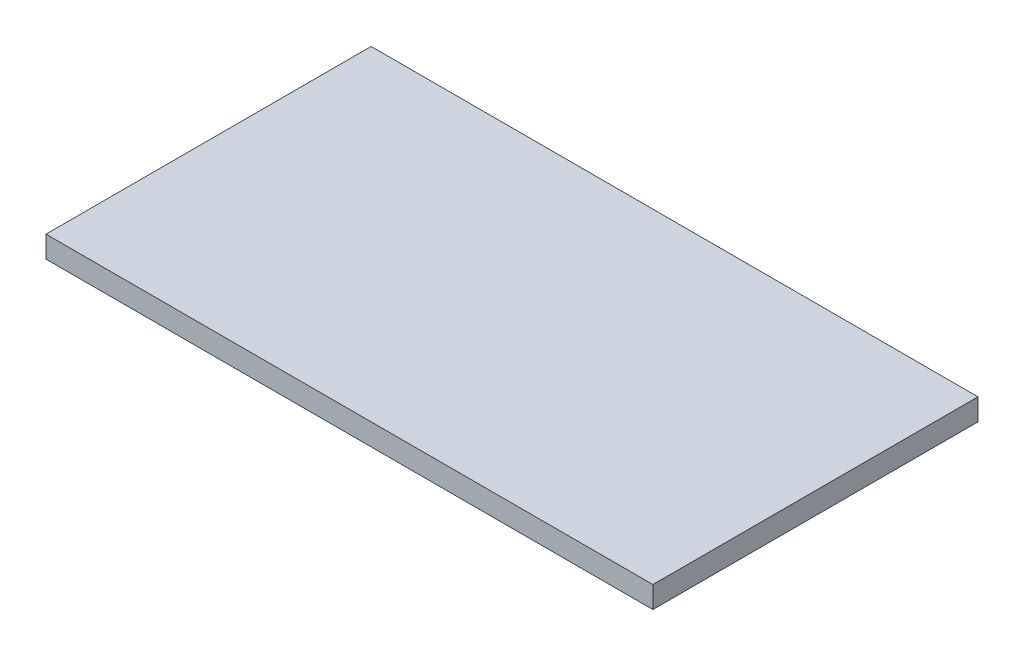
ISO-10303-21;
HEADER;
FILE_DESCRIPTION(('STEP AP214'),'2;1');
FILE_NAME('part.step','',(''),(''),'','','');
FILE_SCHEMA(('AUTOMOTIVE_DESIGN { 1 0 10303 214 1 1 1 1 }'));
ENDSEC;
DATA;
#1=APPLICATION_CONTEXT('core data for automotive mechanical design processes');
#2=APPLICATION_PROTOCOL_DEFINITION('international standard','automotive_design',2000,#1);
#3=PRODUCT_CONTEXT('',#1,'mechanical');
#4=PRODUCT('Part','Part','',(#3));
#5=PRODUCT_RELATED_PRODUCT_CATEGORY('part','',(#4));
#6=PRODUCT_DEFINITION_FORMATION('','',#4);
#7=PRODUCT_DEFINITION_CONTEXT('part definition',#1,'design');
#8=PRODUCT_DEFINITION('design','',#6,#7);
#9=PRODUCT_DEFINITION_SHAPE('','',#8);
#10=(LENGTH_UNIT() NAMED_UNIT(*) SI_UNIT(.MILLI.,.METRE.));
#11=(NAMED_UNIT(*) PLANE_ANGLE_UNIT() SI_UNIT($,.RADIAN.));
#12=(NAMED_UNIT(*) SI_UNIT($,.STERADIAN.) SOLID_ANGLE_UNIT());
#13=UNCERTAINTY_MEASURE_WITH_UNIT(LENGTH_MEASURE(1.E-05),#10,'distance_accuracy_value','');
#14=(GEOMETRIC_REPRESENTATION_CONTEXT(3) GLOBAL_UNCERTAINTY_ASSIGNED_CONTEXT((#13)) GLOBAL_UNIT_ASSIGNED_CONTEXT((#10,
#11,#12)) REPRESENTATION_CONTEXT('',''));
#15=CARTESIAN_POINT('',(0.,0.,0.));
#16=DIRECTION('',(0.,0.,1.));
#17=DIRECTION('',(1.,0.,0.));
#18=AXIS2_PLACEMENT_3D('',#15,#16,#17);
#19=CARTESIAN_POINT('',(0.,50.8,0.));
#20=DIRECTION('',(1.,0.,0.));
#21=DIRECTION('',(0.,0.,-1.));
#22=AXIS2_PLACEMENT_3D('',#19,#20,#21);
#23=PLANE('',#22);
#24=DIRECTION('',(0.,0.,1.));
#25=VECTOR('',#24,1.);
#26=CARTESIAN_POINT('',(0.,0.,0.));
#27=LINE('',#26,#25);
#28=CARTESIAN_POINT('',(0.,0.,-762.));
#29=VERTEX_POINT('',#28);
#30=CARTESIAN_POINT('',(0.,0.,0.));
#31=VERTEX_POINT('',#30);
#32=EDGE_CURVE('E111',#29,#31,#27,.T.);
#33=ORIENTED_EDGE('',*,*,#32,.T.);
#34=DIRECTION('',(0.,-1.,0.));
#35=VECTOR('',#34,1.);
#36=CARTESIAN_POINT('',(0.,50.8,0.));
#37=LINE('',#36,#35);
#38=CARTESIAN_POINT('',(0.,50.8,0.));
#39=VERTEX_POINT('',#38);
#40=EDGE_CURVE('E11',#39,#31,#37,.T.);
#41=ORIENTED_EDGE('',*,*,#40,.F.);
#42=DIRECTION('',(0.,0.,1.));
#43=VECTOR('',#42,1.);
#44=CARTESIAN_POINT('',(0.,50.8,0.));
#45=LINE('',#44,#43);
#46=CARTESIAN_POINT('',(0.,50.8,-762.));
#47=VERTEX_POINT('',#46);
#48=EDGE_CURVE('E95',#47,#39,#45,.T.);
#49=ORIENTED_EDGE('',*,*,#48,.F.);
#50=DIRECTION('',(0.,-1.,0.));
#51=VECTOR('',#50,1.);
#52=CARTESIAN_POINT('',(0.,50.8,-762.));
#53=LINE('',#52,#51);
#54=EDGE_CURVE('E107',#47,#29,#53,.T.);
#55=ORIENTED_EDGE('',*,*,#54,.T.);
#56=EDGE_LOOP('',(#33,#41,#49,#55));
#57=FACE_BOUND('',#56,.T.);
#58=ADVANCED_FACE('F43',(#57),#23,.F.);
#59=CARTESIAN_POINT('',(0.,50.8,0.));
#60=DIRECTION('',(0.,0.,-1.));
#61=DIRECTION('',(-1.,0.,0.));
#62=AXIS2_PLACEMENT_3D('',#59,#60,#61);
#63=PLANE('',#62);
#64=DIRECTION('',(1.,0.,0.));
#65=VECTOR('',#64,1.);
#66=CARTESIAN_POINT('',(0.,0.,0.));
#67=LINE('',#66,#65);
#68=CARTESIAN_POINT('',(1422.4,0.,0.));
#69=VERTEX_POINT('',#68);
#70=EDGE_CURVE('E100',#31,#69,#67,.T.);
#71=ORIENTED_EDGE('',*,*,#70,.T.);
#72=DIRECTION('',(0.,-1.,0.));
#73=VECTOR('',#72,1.);
#74=CARTESIAN_POINT('',(1422.4,50.8,0.));
#75=LINE('',#74,#73);
#76=CARTESIAN_POINT('',(1422.4,50.8,0.));
#77=VERTEX_POINT('',#76);
#78=EDGE_CURVE('E52',#77,#69,#75,.T.);
#79=ORIENTED_EDGE('',*,*,#78,.F.);
#80=DIRECTION('',(1.,0.,0.));
#81=VECTOR('',#80,1.);
#82=CARTESIAN_POINT('',(0.,50.8,0.));
#83=LINE('',#82,#81);
#84=EDGE_CURVE('E90',#39,#77,#83,.T.);
#85=ORIENTED_EDGE('',*,*,#84,.F.);
#86=ORIENTED_EDGE('',*,*,#40,.T.);
#87=EDGE_LOOP('',(#71,#79,#85,#86));
#88=FACE_BOUND('',#87,.T.);
#89=ADVANCED_FACE('F99',(#88),#63,.F.);
#90=CARTESIAN_POINT('',(1422.4,50.8,0.));
#91=DIRECTION('',(-1.,0.,0.));
#92=DIRECTION('',(0.,0.,1.));
#93=AXIS2_PLACEMENT_3D('',#90,#91,#92);
#94=PLANE('',#93);
#95=DIRECTION('',(0.,0.,-1.));
#96=VECTOR('',#95,1.);
#97=CARTESIAN_POINT('',(1422.4,0.,0.));
#98=LINE('',#97,#96);
#99=CARTESIAN_POINT('',(1422.4,0.,-762.));
#100=VERTEX_POINT('',#99);
#101=EDGE_CURVE('E77',#69,#100,#98,.T.);
#102=ORIENTED_EDGE('',*,*,#101,.T.);
#103=DIRECTION('',(0.,-1.,0.));
#104=VECTOR('',#103,1.);
#105=CARTESIAN_POINT('',(1422.4,50.8,-762.));
#106=LINE('',#105,#104);
#107=CARTESIAN_POINT('',(1422.4,50.8,-762.));
#108=VERTEX_POINT('',#107);
#109=EDGE_CURVE('E102',#108,#100,#106,.T.);
#110=ORIENTED_EDGE('',*,*,#109,.F.);
#111=DIRECTION('',(0.,0.,-1.));
#112=VECTOR('',#111,1.);
#113=CARTESIAN_POINT('',(1422.4,50.8,0.));
#114=LINE('',#113,#112);
#115=EDGE_CURVE('E93',#77,#108,#114,.T.);
#116=ORIENTED_EDGE('',*,*,#115,.F.);
#117=ORIENTED_EDGE('',*,*,#78,.T.);
#118=EDGE_LOOP('',(#102,#110,#116,#117));
#119=FACE_BOUND('',#118,.T.);
#120=ADVANCED_FACE('F103',(#119),#94,.F.);
#121=CARTESIAN_POINT('',(0.,50.8,-762.));
#122=DIRECTION('',(0.,0.,1.));
#123=DIRECTION('',(1.,0.,0.));
#124=AXIS2_PLACEMENT_3D('',#121,#122,#123);
#125=PLANE('',#124);
#126=DIRECTION('',(-1.,0.,0.));
#127=VECTOR('',#126,1.);
#128=CARTESIAN_POINT('',(0.,0.,-762.));
#129=LINE('',#128,#127);
#130=EDGE_CURVE('E83',#100,#29,#129,.T.);
#131=ORIENTED_EDGE('',*,*,#130,.T.);
#132=ORIENTED_EDGE('',*,*,#54,.F.);
#133=DIRECTION('',(-1.,0.,0.));
#134=VECTOR('',#133,1.);
#135=CARTESIAN_POINT('',(0.,50.8,-762.));
#136=LINE('',#135,#134);
#137=EDGE_CURVE('E60',#108,#47,#136,.T.);
#138=ORIENTED_EDGE('',*,*,#137,.F.);
#139=ORIENTED_EDGE('',*,*,#109,.T.);
#140=EDGE_LOOP('',(#131,#132,#138,#139));
#141=FACE_BOUND('',#140,.T.);
#142=ADVANCED_FACE('F124',(#141),#125,.F.);
#143=CARTESIAN_POINT('',(0.,50.8,0.));
#144=DIRECTION('',(0.,-1.,0.));
#145=DIRECTION('',(0.,0.,-1.));
#146=AXIS2_PLACEMENT_3D('',#143,#144,#145);
#147=PLANE('',#146);
#148=ORIENTED_EDGE('',*,*,#48,.T.);
#149=ORIENTED_EDGE('',*,*,#84,.T.);
#150=ORIENTED_EDGE('',*,*,#115,.T.);
#151=ORIENTED_EDGE('',*,*,#137,.T.);
#152=EDGE_LOOP('',(#148,#149,#150,#151));
#153=FACE_BOUND('',#152,.T.);
#154=ADVANCED_FACE('F91',(#153),#147,.F.);
#155=CARTESIAN_POINT('',(0.,0.,0.));
#156=DIRECTION('',(0.,-1.,0.));
#157=DIRECTION('',(0.,0.,-1.));
#158=AXIS2_PLACEMENT_3D('',#155,#156,#157);
#159=PLANE('',#158);
#160=ORIENTED_EDGE('',*,*,#32,.F.);
#161=ORIENTED_EDGE('',*,*,#130,.F.);
#162=ORIENTED_EDGE('',*,*,#101,.F.);
#163=ORIENTED_EDGE('',*,*,#70,.F.);
#164=EDGE_LOOP('',(#160,#161,#162,#163));
#165=FACE_BOUND('',#164,.T.);
#166=ADVANCED_FACE('F127',(#165),#159,.T.);
#167=CLOSED_SHELL('',(#58,#89,#120,#142,#154,#166));
#168=MANIFOLD_SOLID_BREP('B2',#167);
#169=ADVANCED_BREP_SHAPE_REPRESENTATION('',(#18,#168),#14);
#170=SHAPE_DEFINITION_REPRESENTATION(#9,#169);
ENDSEC;
END-ISO-10303-21;
